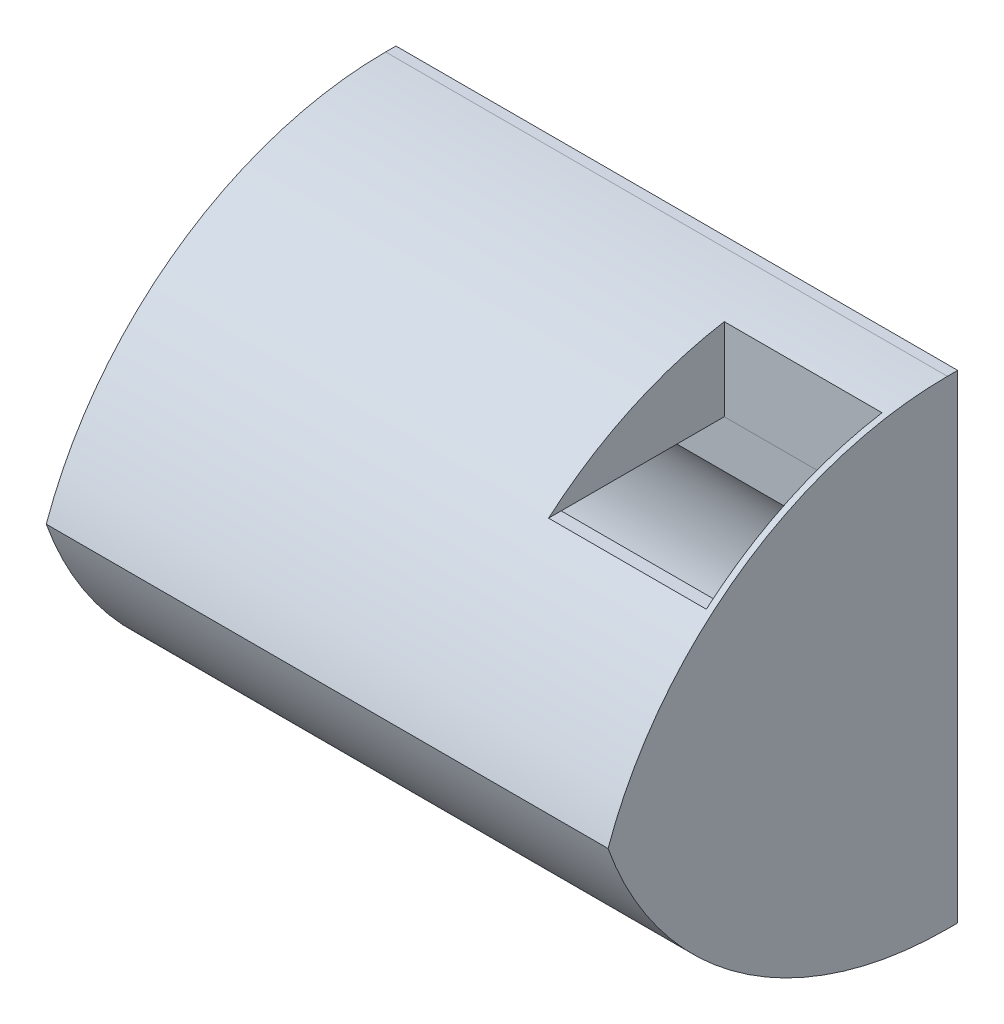
ISO-10303-21;
HEADER;
FILE_DESCRIPTION(('STEP AP214'),'2;1');
FILE_NAME('part.step','',(''),(''),'','','');
FILE_SCHEMA(('AUTOMOTIVE_DESIGN { 1 0 10303 214 1 1 1 1 }'));
ENDSEC;
DATA;
#1=APPLICATION_CONTEXT('core data for automotive mechanical design processes');
#2=APPLICATION_PROTOCOL_DEFINITION('international standard','automotive_design',2000,#1);
#3=PRODUCT_CONTEXT('',#1,'mechanical');
#4=PRODUCT('Part','Part','',(#3));
#5=PRODUCT_RELATED_PRODUCT_CATEGORY('part','',(#4));
#6=PRODUCT_DEFINITION_FORMATION('','',#4);
#7=PRODUCT_DEFINITION_CONTEXT('part definition',#1,'design');
#8=PRODUCT_DEFINITION('design','',#6,#7);
#9=PRODUCT_DEFINITION_SHAPE('','',#8);
#10=(LENGTH_UNIT() NAMED_UNIT(*) SI_UNIT(.MILLI.,.METRE.));
#11=(NAMED_UNIT(*) PLANE_ANGLE_UNIT() SI_UNIT($,.RADIAN.));
#12=(NAMED_UNIT(*) SI_UNIT($,.STERADIAN.) SOLID_ANGLE_UNIT());
#13=UNCERTAINTY_MEASURE_WITH_UNIT(LENGTH_MEASURE(1.E-05),#10,'distance_accuracy_value','');
#14=(GEOMETRIC_REPRESENTATION_CONTEXT(3) GLOBAL_UNCERTAINTY_ASSIGNED_CONTEXT((#13)) GLOBAL_UNIT_ASSIGNED_CONTEXT((#10,
#11,#12)) REPRESENTATION_CONTEXT('',''));
#15=CARTESIAN_POINT('',(0.,0.,0.));
#16=DIRECTION('',(0.,0.,1.));
#17=DIRECTION('',(1.,0.,0.));
#18=AXIS2_PLACEMENT_3D('',#15,#16,#17);
#19=CARTESIAN_POINT('',(0.,15.731520297955,36.));
#20=DIRECTION('',(0.,-1.,0.));
#21=DIRECTION('',(0.,0.,-1.));
#22=AXIS2_PLACEMENT_3D('',#19,#20,#21);
#23=PLANE('',#22);
#24=DIRECTION('',(0.,0.,-1.));
#25=VECTOR('',#24,1.);
#26=CARTESIAN_POINT('',(-74.9254141863573,15.731520297955,36.));
#27=LINE('',#26,#25);
#28=CARTESIAN_POINT('',(-74.9254141863573,15.731520297955,0.999999999999994));
#29=VERTEX_POINT('',#28);
#30=CARTESIAN_POINT('',(-74.9254141863573,15.731520297955,0.));
#31=VERTEX_POINT('',#30);
#32=EDGE_CURVE('E236',#29,#31,#27,.T.);
#33=ORIENTED_EDGE('',*,*,#32,.F.);
#34=DIRECTION('',(-1.,0.,0.));
#35=VECTOR('',#34,1.);
#36=CARTESIAN_POINT('',(-36.3465938105707,15.731520297955,0.999999999999994));
#37=LINE('',#36,#35);
#38=CARTESIAN_POINT('',(-20.3465938105708,15.731520297955,0.999999999999994));
#39=VERTEX_POINT('',#38);
#40=EDGE_CURVE('E242',#29,#39,#37,.F.);
#41=ORIENTED_EDGE('',*,*,#40,.T.);
#42=DIRECTION('',(0.,0.,1.));
#43=VECTOR('',#42,1.);
#44=CARTESIAN_POINT('',(-20.3465938105708,15.731520297955,0.));
#45=LINE('',#44,#43);
#46=CARTESIAN_POINT('',(-20.3465938105708,15.731520297955,0.));
#47=VERTEX_POINT('',#46);
#48=EDGE_CURVE('E209',#47,#39,#45,.T.);
#49=ORIENTED_EDGE('',*,*,#48,.F.);
#50=DIRECTION('',(-1.,0.,0.));
#51=VECTOR('',#50,1.);
#52=CARTESIAN_POINT('',(0.,15.731520297955,0.));
#53=LINE('',#52,#51);
#54=EDGE_CURVE('E225',#47,#31,#53,.T.);
#55=ORIENTED_EDGE('',*,*,#54,.T.);
#56=EDGE_LOOP('',(#33,#41,#49,#55));
#57=FACE_BOUND('',#56,.T.);
#58=ADVANCED_FACE('F36',(#57),#23,.F.);
#59=CARTESIAN_POINT('',(-74.9254141863573,0.,36.));
#60=DIRECTION('',(1.,0.,0.));
#61=DIRECTION('',(0.,0.,-1.));
#62=AXIS2_PLACEMENT_3D('',#59,#60,#61);
#63=PLANE('',#62);
#64=CARTESIAN_POINT('',(-74.9254141863573,-8.31763911028495,15.0350561175905));
#65=DIRECTION('',(-1.,0.,0.));
#66=DIRECTION('',(0.,0.,1.));
#67=AXIS2_PLACEMENT_3D('',#64,#65,#66);
#68=CIRCLE('',#67,13.7230367290424);
#69=CARTESIAN_POINT('',(-74.9254141863573,2.56405083904246,6.67380256842977));
#70=VERTEX_POINT('',#69);
#71=CARTESIAN_POINT('',(-74.9254141863573,3.12492913471487,22.6106332589816));
#72=VERTEX_POINT('',#71);
#73=EDGE_CURVE('E222',#70,#72,#68,.T.);
#74=ORIENTED_EDGE('',*,*,#73,.F.);
#75=DIRECTION('',(0.,-1.,0.));
#76=VECTOR('',#75,1.);
#77=CARTESIAN_POINT('',(-74.9254141863573,2.56405083904246,6.67380256842977));
#78=LINE('',#77,#76);
#79=CARTESIAN_POINT('',(-74.9254141863573,7.25704171402647,6.67380256842977));
#80=VERTEX_POINT('',#79);
#81=EDGE_CURVE('E168',#80,#70,#78,.T.);
#82=ORIENTED_EDGE('',*,*,#81,.F.);
#83=DIRECTION('',(0.,0.,-1.));
#84=VECTOR('',#83,1.);
#85=CARTESIAN_POINT('',(-74.9254141863573,7.25704171402647,6.67380256842977));
#86=LINE('',#85,#84);
#87=CARTESIAN_POINT('',(-74.9254141863573,7.25704171402647,22.6106332589816));
#88=VERTEX_POINT('',#87);
#89=EDGE_CURVE('E173',#88,#80,#86,.T.);
#90=ORIENTED_EDGE('',*,*,#89,.F.);
#91=DIRECTION('',(0.,1.,0.));
#92=VECTOR('',#91,1.);
#93=CARTESIAN_POINT('',(-74.9254141863573,2.56405083904246,22.6106332589816));
#94=LINE('',#93,#92);
#95=EDGE_CURVE('E184',#72,#88,#94,.T.);
#96=ORIENTED_EDGE('',*,*,#95,.F.);
#97=EDGE_LOOP('',(#74,#82,#90,#96));
#98=FACE_BOUND('',#97,.T.);
#99=CARTESIAN_POINT('',(-74.9254141863573,4.2392542041867,0.999999999999994));
#100=DIRECTION('',(1.,0.,0.));
#101=DIRECTION('',(0.,0.,-1.));
#102=AXIS2_PLACEMENT_3D('',#99,#100,#101);
#103=CIRCLE('',#102,35.);
#104=CARTESIAN_POINT('',(-74.9254141863573,-30.7607457958133,0.999999999999994));
#105=VERTEX_POINT('',#104);
#106=CARTESIAN_POINT('',(-74.9254141863573,-7.51461274892915,33.9673567585946));
#107=VERTEX_POINT('',#106);
#108=EDGE_CURVE('E238',#105,#107,#103,.F.);
#109=ORIENTED_EDGE('',*,*,#108,.T.);
#110=CARTESIAN_POINT('',(-74.9254141863573,-19.268479702045,0.999999999999994));
#111=DIRECTION('',(1.,0.,0.));
#112=DIRECTION('',(0.,0.,-1.));
#113=AXIS2_PLACEMENT_3D('',#110,#111,#112);
#114=CIRCLE('',#113,35.);
#115=EDGE_CURVE('E240',#107,#29,#114,.F.);
#116=ORIENTED_EDGE('',*,*,#115,.T.);
#117=ORIENTED_EDGE('',*,*,#32,.T.);
#118=DIRECTION('',(0.,-1.,0.));
#119=VECTOR('',#118,1.);
#120=CARTESIAN_POINT('',(-74.9254141863573,0.,0.));
#121=LINE('',#120,#119);
#122=CARTESIAN_POINT('',(-74.9254141863573,-30.7607457958133,0.));
#123=VERTEX_POINT('',#122);
#124=EDGE_CURVE('E228',#31,#123,#121,.T.);
#125=ORIENTED_EDGE('',*,*,#124,.T.);
#126=DIRECTION('',(0.,0.,-1.));
#127=VECTOR('',#126,1.);
#128=CARTESIAN_POINT('',(-74.9254141863573,-30.7607457958133,36.));
#129=LINE('',#128,#127);
#130=EDGE_CURVE('E234',#105,#123,#129,.T.);
#131=ORIENTED_EDGE('',*,*,#130,.F.);
#132=EDGE_LOOP('',(#109,#116,#117,#125,#131));
#133=FACE_BOUND('',#132,.T.);
#134=ADVANCED_FACE('F270',(#98,#133),#63,.F.);
#135=CARTESIAN_POINT('',(0.,-30.7607457958133,36.));
#136=DIRECTION('',(0.,-1.,0.));
#137=DIRECTION('',(0.,0.,-1.));
#138=AXIS2_PLACEMENT_3D('',#135,#136,#137);
#139=PLANE('',#138);
#140=DIRECTION('',(-1.,0.,0.));
#141=VECTOR('',#140,1.);
#142=CARTESIAN_POINT('',(0.,-30.7607457958133,0.));
#143=LINE('',#142,#141);
#144=CARTESIAN_POINT('',(-20.3465938105708,-30.7607457958133,0.));
#145=VERTEX_POINT('',#144);
#146=EDGE_CURVE('E231',#145,#123,#143,.T.);
#147=ORIENTED_EDGE('',*,*,#146,.F.);
#148=DIRECTION('',(0.,0.,-1.));
#149=VECTOR('',#148,1.);
#150=CARTESIAN_POINT('',(-20.3465938105708,-30.7607457958133,1.));
#151=LINE('',#150,#149);
#152=CARTESIAN_POINT('',(-20.3465938105708,-30.7607457958133,1.));
#153=VERTEX_POINT('',#152);
#154=EDGE_CURVE('E218',#153,#145,#151,.T.);
#155=ORIENTED_EDGE('',*,*,#154,.F.);
#156=DIRECTION('',(-1.,0.,0.));
#157=VECTOR('',#156,1.);
#158=CARTESIAN_POINT('',(0.,-30.7607457958133,0.999999999999994));
#159=LINE('',#158,#157);
#160=EDGE_CURVE('E244',#153,#105,#159,.T.);
#161=ORIENTED_EDGE('',*,*,#160,.T.);
#162=ORIENTED_EDGE('',*,*,#130,.T.);
#163=EDGE_LOOP('',(#147,#155,#161,#162));
#164=FACE_BOUND('',#163,.T.);
#165=ADVANCED_FACE('F298',(#164),#139,.T.);
#166=CARTESIAN_POINT('',(0.,0.,0.));
#167=DIRECTION('',(0.,0.,1.));
#168=DIRECTION('',(1.,0.,0.));
#169=AXIS2_PLACEMENT_3D('',#166,#167,#168);
#170=PLANE('',#169);
#171=ORIENTED_EDGE('',*,*,#54,.F.);
#172=DIRECTION('',(0.,1.,0.));
#173=VECTOR('',#172,1.);
#174=CARTESIAN_POINT('',(-20.3465938105708,-30.7607457958133,0.));
#175=LINE('',#174,#173);
#176=EDGE_CURVE('E206',#145,#47,#175,.T.);
#177=ORIENTED_EDGE('',*,*,#176,.F.);
#178=ORIENTED_EDGE('',*,*,#146,.T.);
#179=ORIENTED_EDGE('',*,*,#124,.F.);
#180=EDGE_LOOP('',(#171,#177,#178,#179));
#181=FACE_BOUND('',#180,.T.);
#182=ADVANCED_FACE('F303',(#181),#170,.F.);
#183=CARTESIAN_POINT('',(-20.9254141863573,-8.31763911028495,15.0350561175905));
#184=DIRECTION('',(-1.,0.,0.));
#185=DIRECTION('',(0.,0.,1.));
#186=AXIS2_PLACEMENT_3D('',#183,#184,#185);
#187=CYLINDRICAL_SURFACE('',#186,13.7230367290424);
#188=ORIENTED_EDGE('',*,*,#73,.T.);
#189=DIRECTION('',(-1.,0.,0.));
#190=VECTOR('',#189,1.);
#191=CARTESIAN_POINT('',(-20.9254141863573,3.12492913471487,22.6106332589816));
#192=LINE('',#191,#190);
#193=CARTESIAN_POINT('',(-22.3465938105708,3.12492913471487,22.6106332589816));
#194=VERTEX_POINT('',#193);
#195=EDGE_CURVE('E191',#72,#194,#192,.F.);
#196=ORIENTED_EDGE('',*,*,#195,.T.);
#197=CARTESIAN_POINT('',(-22.3465938105708,-8.31763911028495,15.0350561175905));
#198=DIRECTION('',(-1.,0.,0.));
#199=DIRECTION('',(0.,0.,1.));
#200=AXIS2_PLACEMENT_3D('',#197,#198,#199);
#201=CIRCLE('',#200,13.7230367290424);
#202=CARTESIAN_POINT('',(-22.3465938105708,2.56405083904246,6.67380256842977));
#203=VERTEX_POINT('',#202);
#204=EDGE_CURVE('E203',#203,#194,#201,.T.);
#205=ORIENTED_EDGE('',*,*,#204,.F.);
#206=DIRECTION('',(-1.,0.,0.));
#207=VECTOR('',#206,1.);
#208=CARTESIAN_POINT('',(-20.9254141863573,2.56405083904246,6.67380256842977));
#209=LINE('',#208,#207);
#210=EDGE_CURVE('E182',#203,#70,#209,.T.);
#211=ORIENTED_EDGE('',*,*,#210,.T.);
#212=EDGE_LOOP('',(#188,#196,#205,#211));
#213=FACE_BOUND('',#212,.T.);
#214=ADVANCED_FACE('F257',(#213),#187,.F.);
#215=CARTESIAN_POINT('',(0.,4.2392542041867,0.999999999999994));
#216=DIRECTION('',(-1.,0.,0.));
#217=DIRECTION('',(0.,0.,1.));
#218=AXIS2_PLACEMENT_3D('',#215,#216,#217);
#219=CYLINDRICAL_SURFACE('',#218,35.);
#220=ORIENTED_EDGE('',*,*,#160,.F.);
#221=CARTESIAN_POINT('',(-20.3465938105708,4.2392542041867,0.999999999999994));
#222=DIRECTION('',(1.,0.,0.));
#223=DIRECTION('',(0.,0.,-1.));
#224=AXIS2_PLACEMENT_3D('',#221,#222,#223);
#225=CIRCLE('',#224,35.);
#226=CARTESIAN_POINT('',(-20.3465938105708,-7.51461274892915,33.9673567585946));
#227=VERTEX_POINT('',#226);
#228=EDGE_CURVE('E215',#227,#153,#225,.T.);
#229=ORIENTED_EDGE('',*,*,#228,.F.);
#230=DIRECTION('',(-1.,0.,0.));
#231=VECTOR('',#230,1.);
#232=CARTESIAN_POINT('',(-55.636003998464,-7.51461274892915,33.9673567585946));
#233=LINE('',#232,#231);
#234=EDGE_CURVE('E221',#107,#227,#233,.F.);
#235=ORIENTED_EDGE('',*,*,#234,.F.);
#236=ORIENTED_EDGE('',*,*,#108,.F.);
#237=EDGE_LOOP('',(#220,#229,#235,#236));
#238=FACE_BOUND('',#237,.T.);
#239=ADVANCED_FACE('F38',(#238),#219,.T.);
#240=CARTESIAN_POINT('',(0.,-19.268479702045,0.999999999999994));
#241=DIRECTION('',(1.,0.,0.));
#242=DIRECTION('',(0.,0.,-1.));
#243=AXIS2_PLACEMENT_3D('',#240,#241,#242);
#244=CYLINDRICAL_SURFACE('',#243,35.);
#245=CARTESIAN_POINT('',(-20.9374402094457,-19.268479702045,0.999999999999994));
#246=DIRECTION('',(1.,0.,0.));
#247=DIRECTION('',(0.,0.,-1.));
#248=AXIS2_PLACEMENT_3D('',#245,#246,#247);
#249=CIRCLE('',#248,35.);
#250=CARTESIAN_POINT('',(-20.9374402094457,7.25704171402647,23.8341129366904));
#251=VERTEX_POINT('',#250);
#252=CARTESIAN_POINT('',(-20.9374402094457,15.2537326389324,6.7634065520722));
#253=VERTEX_POINT('',#252);
#254=EDGE_CURVE('E164',#251,#253,#249,.F.);
#255=ORIENTED_EDGE('',*,*,#254,.F.);
#256=DIRECTION('',(1.,0.,0.));
#257=VECTOR('',#256,1.);
#258=CARTESIAN_POINT('',(0.,7.25704171402647,23.8341129366904));
#259=LINE('',#258,#257);
#260=CARTESIAN_POINT('',(-36.2604419553281,7.25704171402647,23.8341129366904));
#261=VERTEX_POINT('',#260);
#262=EDGE_CURVE('E166',#261,#251,#259,.T.);
#263=ORIENTED_EDGE('',*,*,#262,.F.);
#264=CARTESIAN_POINT('',(-36.2604419553281,-19.268479702045,0.999999999999994));
#265=DIRECTION('',(-1.,0.,0.));
#266=DIRECTION('',(0.,0.,1.));
#267=AXIS2_PLACEMENT_3D('',#264,#265,#266);
#268=CIRCLE('',#267,35.);
#269=CARTESIAN_POINT('',(-36.2604419553281,15.2537326389324,6.7634065520722));
#270=VERTEX_POINT('',#269);
#271=EDGE_CURVE('E160',#270,#261,#268,.F.);
#272=ORIENTED_EDGE('',*,*,#271,.F.);
#273=DIRECTION('',(1.,0.,0.));
#274=VECTOR('',#273,1.);
#275=CARTESIAN_POINT('',(0.,15.2537326389324,6.7634065520722));
#276=LINE('',#275,#274);
#277=EDGE_CURVE('E145',#253,#270,#276,.F.);
#278=ORIENTED_EDGE('',*,*,#277,.F.);
#279=EDGE_LOOP('',(#255,#263,#272,#278));
#280=FACE_BOUND('',#279,.T.);
#281=ORIENTED_EDGE('',*,*,#234,.T.);
#282=CARTESIAN_POINT('',(-20.3465938105708,-19.268479702045,0.999999999999994));
#283=DIRECTION('',(1.,0.,0.));
#284=DIRECTION('',(0.,0.,-1.));
#285=AXIS2_PLACEMENT_3D('',#282,#283,#284);
#286=CIRCLE('',#285,35.);
#287=EDGE_CURVE('E212',#39,#227,#286,.T.);
#288=ORIENTED_EDGE('',*,*,#287,.F.);
#289=ORIENTED_EDGE('',*,*,#40,.F.);
#290=ORIENTED_EDGE('',*,*,#115,.F.);
#291=EDGE_LOOP('',(#281,#288,#289,#290));
#292=FACE_BOUND('',#291,.T.);
#293=ADVANCED_FACE('F282',(#280,#292),#244,.T.);
#294=CARTESIAN_POINT('',(-20.3465938105708,-19.268479702045,0.999999999999994));
#295=DIRECTION('',(1.,0.,0.));
#296=DIRECTION('',(0.,0.,-1.));
#297=AXIS2_PLACEMENT_3D('',#294,#295,#296);
#298=PLANE('',#297);
#299=ORIENTED_EDGE('',*,*,#176,.T.);
#300=ORIENTED_EDGE('',*,*,#48,.T.);
#301=ORIENTED_EDGE('',*,*,#287,.T.);
#302=ORIENTED_EDGE('',*,*,#228,.T.);
#303=ORIENTED_EDGE('',*,*,#154,.T.);
#304=EDGE_LOOP('',(#299,#300,#301,#302,#303));
#305=FACE_BOUND('',#304,.T.);
#306=ADVANCED_FACE('F285',(#305),#298,.T.);
#307=CARTESIAN_POINT('',(-22.3465938105708,-8.31763911028495,15.0350561175905));
#308=DIRECTION('',(-1.,0.,0.));
#309=DIRECTION('',(0.,0.,1.));
#310=AXIS2_PLACEMENT_3D('',#307,#308,#309);
#311=PLANE('',#310);
#312=DIRECTION('',(0.,1.,0.));
#313=VECTOR('',#312,1.);
#314=CARTESIAN_POINT('',(-22.3465938105708,-8.31763911028495,22.6106332589816));
#315=LINE('',#314,#313);
#316=CARTESIAN_POINT('',(-22.3465938105708,2.56405083904246,22.6106332589816));
#317=VERTEX_POINT('',#316);
#318=EDGE_CURVE('E44',#317,#194,#315,.T.);
#319=ORIENTED_EDGE('',*,*,#318,.F.);
#320=DIRECTION('',(0.,0.,1.));
#321=VECTOR('',#320,1.);
#322=CARTESIAN_POINT('',(-22.3465938105708,2.56405083904246,15.0350561175905));
#323=LINE('',#322,#321);
#324=EDGE_CURVE('E246',#203,#317,#323,.T.);
#325=ORIENTED_EDGE('',*,*,#324,.F.);
#326=ORIENTED_EDGE('',*,*,#204,.T.);
#327=EDGE_LOOP('',(#319,#325,#326));
#328=FACE_BOUND('',#327,.T.);
#329=ADVANCED_FACE('F260',(#328),#311,.T.);
#330=CARTESIAN_POINT('',(-20.9254141863573,2.56405083904246,22.6106332589816));
#331=DIRECTION('',(0.,0.,1.));
#332=DIRECTION('',(1.,0.,0.));
#333=AXIS2_PLACEMENT_3D('',#330,#331,#332);
#334=PLANE('',#333);
#335=ORIENTED_EDGE('',*,*,#95,.T.);
#336=DIRECTION('',(-1.,0.,0.));
#337=VECTOR('',#336,1.);
#338=CARTESIAN_POINT('',(-20.9254141863573,7.25704171402647,22.6106332589816));
#339=LINE('',#338,#337);
#340=CARTESIAN_POINT('',(-36.2604419553281,7.25704171402647,22.6106332589816));
#341=VERTEX_POINT('',#340);
#342=EDGE_CURVE('E195',#341,#88,#339,.T.);
#343=ORIENTED_EDGE('',*,*,#342,.F.);
#344=CARTESIAN_POINT('',(-20.9374402094457,7.25704171402647,22.6106332589816));
#345=VERTEX_POINT('',#344);
#346=EDGE_CURVE('E194',#345,#341,#339,.T.);
#347=ORIENTED_EDGE('',*,*,#346,.F.);
#348=CARTESIAN_POINT('',(-20.9254141863573,7.25704171402647,22.6106332589816));
#349=VERTEX_POINT('',#348);
#350=EDGE_CURVE('E192',#349,#345,#339,.T.);
#351=ORIENTED_EDGE('',*,*,#350,.F.);
#352=DIRECTION('',(0.,1.,0.));
#353=VECTOR('',#352,1.);
#354=CARTESIAN_POINT('',(-20.9254141863573,2.56405083904246,22.6106332589816));
#355=LINE('',#354,#353);
#356=CARTESIAN_POINT('',(-20.9254141863573,2.56405083904246,22.6106332589816));
#357=VERTEX_POINT('',#356);
#358=EDGE_CURVE('E176',#357,#349,#355,.T.);
#359=ORIENTED_EDGE('',*,*,#358,.F.);
#360=DIRECTION('',(-1.,0.,0.));
#361=VECTOR('',#360,1.);
#362=CARTESIAN_POINT('',(-20.9254141863573,2.56405083904246,22.6106332589816));
#363=LINE('',#362,#361);
#364=EDGE_CURVE('E196',#357,#317,#363,.T.);
#365=ORIENTED_EDGE('',*,*,#364,.T.);
#366=ORIENTED_EDGE('',*,*,#318,.T.);
#367=ORIENTED_EDGE('',*,*,#195,.F.);
#368=EDGE_LOOP('',(#335,#343,#347,#351,#359,#365,#366,#367));
#369=FACE_BOUND('',#368,.T.);
#370=ADVANCED_FACE('F250',(#369),#334,.F.);
#371=CARTESIAN_POINT('',(-20.9254141863573,2.56405083904246,6.67380256842977));
#372=DIRECTION('',(0.,0.,-1.));
#373=DIRECTION('',(-1.,0.,0.));
#374=AXIS2_PLACEMENT_3D('',#371,#372,#373);
#375=PLANE('',#374);
#376=ORIENTED_EDGE('',*,*,#81,.T.);
#377=ORIENTED_EDGE('',*,*,#210,.F.);
#378=CARTESIAN_POINT('',(-20.9254141863573,2.56405083904246,6.67380256842977));
#379=VERTEX_POINT('',#378);
#380=EDGE_CURVE('E199',#379,#203,#209,.T.);
#381=ORIENTED_EDGE('',*,*,#380,.F.);
#382=DIRECTION('',(0.,-1.,0.));
#383=VECTOR('',#382,1.);
#384=CARTESIAN_POINT('',(-20.9254141863573,2.56405083904246,6.67380256842977));
#385=LINE('',#384,#383);
#386=CARTESIAN_POINT('',(-20.9254141863573,7.25704171402647,6.67380256842977));
#387=VERTEX_POINT('',#386);
#388=EDGE_CURVE('E169',#387,#379,#385,.T.);
#389=ORIENTED_EDGE('',*,*,#388,.F.);
#390=DIRECTION('',(-1.,0.,0.));
#391=VECTOR('',#390,1.);
#392=CARTESIAN_POINT('',(-20.9254141863573,7.25704171402647,6.67380256842977));
#393=LINE('',#392,#391);
#394=EDGE_CURVE('E189',#387,#80,#393,.T.);
#395=ORIENTED_EDGE('',*,*,#394,.T.);
#396=EDGE_LOOP('',(#376,#377,#381,#389,#395));
#397=FACE_BOUND('',#396,.T.);
#398=ADVANCED_FACE('F267',(#397),#375,.F.);
#399=CARTESIAN_POINT('',(-20.9254141863573,7.25704171402647,6.67380256842977));
#400=DIRECTION('',(0.,1.,0.));
#401=DIRECTION('',(0.,0.,1.));
#402=AXIS2_PLACEMENT_3D('',#399,#400,#401);
#403=PLANE('',#402);
#404=ORIENTED_EDGE('',*,*,#350,.T.);
#405=DIRECTION('',(0.,0.,1.));
#406=VECTOR('',#405,1.);
#407=CARTESIAN_POINT('',(-20.9374402094457,7.25704171402647,6.7634065520722));
#408=LINE('',#407,#406);
#409=CARTESIAN_POINT('',(-20.9374402094457,7.25704171402647,6.7634065520722));
#410=VERTEX_POINT('',#409);
#411=EDGE_CURVE('E155',#410,#345,#408,.T.);
#412=ORIENTED_EDGE('',*,*,#411,.F.);
#413=DIRECTION('',(1.,0.,0.));
#414=VECTOR('',#413,1.);
#415=CARTESIAN_POINT('',(-20.9374402094457,7.25704171402647,6.7634065520722));
#416=LINE('',#415,#414);
#417=CARTESIAN_POINT('',(-36.2604419553281,7.25704171402647,6.7634065520722));
#418=VERTEX_POINT('',#417);
#419=EDGE_CURVE('E142',#418,#410,#416,.T.);
#420=ORIENTED_EDGE('',*,*,#419,.F.);
#421=DIRECTION('',(0.,0.,1.));
#422=VECTOR('',#421,1.);
#423=CARTESIAN_POINT('',(-36.2604419553281,7.25704171402647,6.67380256842977));
#424=LINE('',#423,#422);
#425=EDGE_CURVE('E11',#418,#341,#424,.T.);
#426=ORIENTED_EDGE('',*,*,#425,.T.);
#427=ORIENTED_EDGE('',*,*,#342,.T.);
#428=ORIENTED_EDGE('',*,*,#89,.T.);
#429=ORIENTED_EDGE('',*,*,#394,.F.);
#430=DIRECTION('',(0.,0.,-1.));
#431=VECTOR('',#430,1.);
#432=CARTESIAN_POINT('',(-20.9254141863573,7.25704171402647,6.67380256842977));
#433=LINE('',#432,#431);
#434=EDGE_CURVE('E179',#349,#387,#433,.T.);
#435=ORIENTED_EDGE('',*,*,#434,.F.);
#436=EDGE_LOOP('',(#404,#412,#420,#426,#427,#428,#429,#435));
#437=FACE_BOUND('',#436,.T.);
#438=ADVANCED_FACE('F153',(#437),#403,.F.);
#439=CARTESIAN_POINT('',(-20.9254141863573,2.56405083904246,6.67380256842977));
#440=DIRECTION('',(0.,-1.,0.));
#441=DIRECTION('',(0.,0.,-1.));
#442=AXIS2_PLACEMENT_3D('',#439,#440,#441);
#443=PLANE('',#442);
#444=ORIENTED_EDGE('',*,*,#324,.T.);
#445=ORIENTED_EDGE('',*,*,#364,.F.);
#446=DIRECTION('',(0.,0.,1.));
#447=VECTOR('',#446,1.);
#448=CARTESIAN_POINT('',(-20.9254141863573,2.56405083904246,6.67380256842977));
#449=LINE('',#448,#447);
#450=EDGE_CURVE('E172',#379,#357,#449,.T.);
#451=ORIENTED_EDGE('',*,*,#450,.F.);
#452=ORIENTED_EDGE('',*,*,#380,.T.);
#453=EDGE_LOOP('',(#444,#445,#451,#452));
#454=FACE_BOUND('',#453,.T.);
#455=ADVANCED_FACE('F262',(#454),#443,.F.);
#456=CARTESIAN_POINT('',(-20.9254141863573,0.,0.));
#457=DIRECTION('',(1.,0.,0.));
#458=DIRECTION('',(0.,0.,-1.));
#459=AXIS2_PLACEMENT_3D('',#456,#457,#458);
#460=PLANE('',#459);
#461=ORIENTED_EDGE('',*,*,#388,.T.);
#462=ORIENTED_EDGE('',*,*,#450,.T.);
#463=ORIENTED_EDGE('',*,*,#358,.T.);
#464=ORIENTED_EDGE('',*,*,#434,.T.);
#465=EDGE_LOOP('',(#461,#462,#463,#464));
#466=FACE_BOUND('',#465,.T.);
#467=ADVANCED_FACE('F326',(#466),#460,.F.);
#468=CARTESIAN_POINT('',(0.,7.25704171402647,0.));
#469=DIRECTION('',(0.,-1.,0.));
#470=DIRECTION('',(0.,0.,-1.));
#471=AXIS2_PLACEMENT_3D('',#468,#469,#470);
#472=PLANE('',#471);
#473=ORIENTED_EDGE('',*,*,#262,.T.);
#474=EDGE_CURVE('E276',#345,#251,#408,.T.);
#475=ORIENTED_EDGE('',*,*,#474,.F.);
#476=ORIENTED_EDGE('',*,*,#346,.T.);
#477=DIRECTION('',(0.,0.,-1.));
#478=VECTOR('',#477,1.);
#479=CARTESIAN_POINT('',(-36.2604419553281,7.25704171402647,6.7634065520722));
#480=LINE('',#479,#478);
#481=EDGE_CURVE('E51',#261,#341,#480,.T.);
#482=ORIENTED_EDGE('',*,*,#481,.F.);
#483=EDGE_LOOP('',(#473,#475,#476,#482));
#484=FACE_BOUND('',#483,.T.);
#485=ADVANCED_FACE('F274',(#484),#472,.F.);
#486=CARTESIAN_POINT('',(-20.9374402094457,61.2570417140264,6.7634065520722));
#487=DIRECTION('',(1.,0.,0.));
#488=DIRECTION('',(0.,0.,-1.));
#489=AXIS2_PLACEMENT_3D('',#486,#487,#488);
#490=PLANE('',#489);
#491=ORIENTED_EDGE('',*,*,#254,.T.);
#492=DIRECTION('',(0.,-1.,0.));
#493=VECTOR('',#492,1.);
#494=CARTESIAN_POINT('',(-20.9374402094457,61.2570417140264,6.7634065520722));
#495=LINE('',#494,#493);
#496=EDGE_CURVE('E147',#253,#410,#495,.T.);
#497=ORIENTED_EDGE('',*,*,#496,.T.);
#498=ORIENTED_EDGE('',*,*,#411,.T.);
#499=ORIENTED_EDGE('',*,*,#474,.T.);
#500=EDGE_LOOP('',(#491,#497,#498,#499));
#501=FACE_BOUND('',#500,.T.);
#502=ADVANCED_FACE('F280',(#501),#490,.F.);
#503=CARTESIAN_POINT('',(-20.9374402094457,61.2570417140264,6.7634065520722));
#504=DIRECTION('',(0.,0.,-1.));
#505=DIRECTION('',(-1.,0.,0.));
#506=AXIS2_PLACEMENT_3D('',#503,#504,#505);
#507=PLANE('',#506);
#508=ORIENTED_EDGE('',*,*,#277,.T.);
#509=DIRECTION('',(0.,-1.,0.));
#510=VECTOR('',#509,1.);
#511=CARTESIAN_POINT('',(-36.2604419553281,61.2570417140264,6.7634065520722));
#512=LINE('',#511,#510);
#513=EDGE_CURVE('E138',#270,#418,#512,.T.);
#514=ORIENTED_EDGE('',*,*,#513,.T.);
#515=ORIENTED_EDGE('',*,*,#419,.T.);
#516=ORIENTED_EDGE('',*,*,#496,.F.);
#517=EDGE_LOOP('',(#508,#514,#515,#516));
#518=FACE_BOUND('',#517,.T.);
#519=ADVANCED_FACE('F139',(#518),#507,.F.);
#520=CARTESIAN_POINT('',(-36.2604419553281,61.2570417140264,6.7634065520722));
#521=DIRECTION('',(-1.,0.,0.));
#522=DIRECTION('',(0.,0.,1.));
#523=AXIS2_PLACEMENT_3D('',#520,#521,#522);
#524=PLANE('',#523);
#525=ORIENTED_EDGE('',*,*,#271,.T.);
#526=ORIENTED_EDGE('',*,*,#481,.T.);
#527=ORIENTED_EDGE('',*,*,#425,.F.);
#528=ORIENTED_EDGE('',*,*,#513,.F.);
#529=EDGE_LOOP('',(#525,#526,#527,#528));
#530=FACE_BOUND('',#529,.T.);
#531=ADVANCED_FACE('F149',(#530),#524,.F.);
#532=CLOSED_SHELL('',(#58,#134,#165,#182,#214,#239,#293,#306,#329,#370,#398,#438,#455,#467,#485,
#502,#519,#531));
#533=MANIFOLD_SOLID_BREP('B2',#532);
#534=ADVANCED_BREP_SHAPE_REPRESENTATION('',(#18,#533),#14);
#535=SHAPE_DEFINITION_REPRESENTATION(#9,#534);
ENDSEC;
END-ISO-10303-21;
